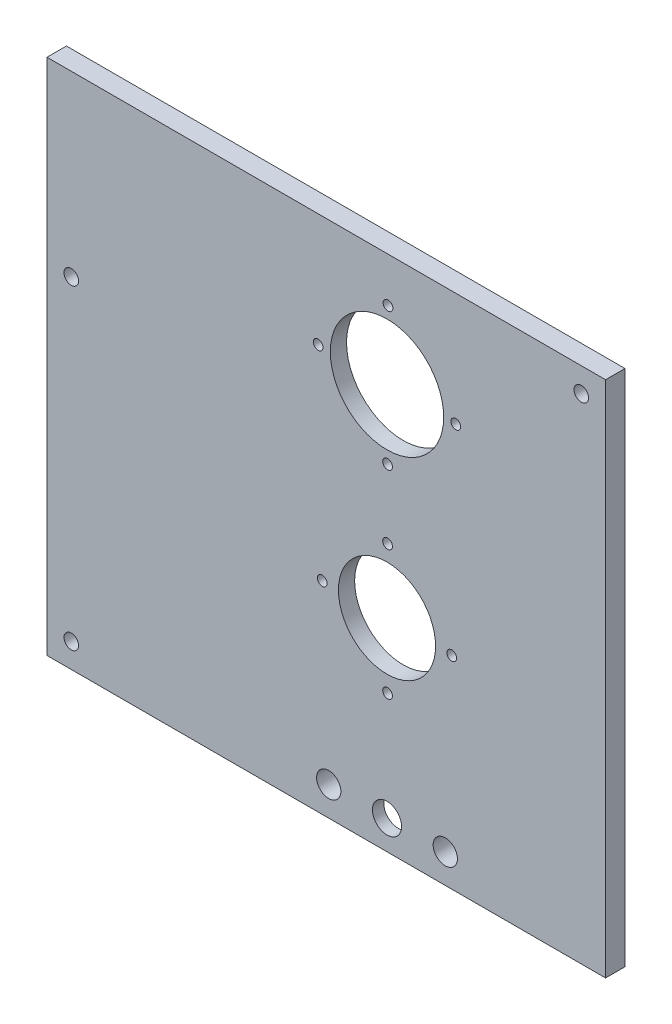
ISO-10303-21;
HEADER;
FILE_DESCRIPTION(('STEP AP214'),'2;1');
FILE_NAME('part.step','',(''),(''),'','','');
FILE_SCHEMA(('AUTOMOTIVE_DESIGN { 1 0 10303 214 1 1 1 1 }'));
ENDSEC;
DATA;
#1=APPLICATION_CONTEXT('core data for automotive mechanical design processes');
#2=APPLICATION_PROTOCOL_DEFINITION('international standard','automotive_design',2000,#1);
#3=PRODUCT_CONTEXT('',#1,'mechanical');
#4=PRODUCT('Part','Part','',(#3));
#5=PRODUCT_RELATED_PRODUCT_CATEGORY('part','',(#4));
#6=PRODUCT_DEFINITION_FORMATION('','',#4);
#7=PRODUCT_DEFINITION_CONTEXT('part definition',#1,'design');
#8=PRODUCT_DEFINITION('design','',#6,#7);
#9=PRODUCT_DEFINITION_SHAPE('','',#8);
#10=(LENGTH_UNIT() NAMED_UNIT(*) SI_UNIT(.MILLI.,.METRE.));
#11=(NAMED_UNIT(*) PLANE_ANGLE_UNIT() SI_UNIT($,.RADIAN.));
#12=(NAMED_UNIT(*) SI_UNIT($,.STERADIAN.) SOLID_ANGLE_UNIT());
#13=UNCERTAINTY_MEASURE_WITH_UNIT(LENGTH_MEASURE(1.E-05),#10,'distance_accuracy_value','');
#14=(GEOMETRIC_REPRESENTATION_CONTEXT(3) GLOBAL_UNCERTAINTY_ASSIGNED_CONTEXT((#13)) GLOBAL_UNIT_ASSIGNED_CONTEXT((#10,
#11,#12)) REPRESENTATION_CONTEXT('',''));
#15=CARTESIAN_POINT('',(0.,0.,0.));
#16=DIRECTION('',(0.,0.,1.));
#17=DIRECTION('',(1.,0.,0.));
#18=AXIS2_PLACEMENT_3D('',#15,#16,#17);
#19=CARTESIAN_POINT('',(70.,-262.,0.));
#20=DIRECTION('',(0.,0.,1.));
#21=DIRECTION('',(1.,0.,0.));
#22=AXIS2_PLACEMENT_3D('',#19,#20,#21);
#23=CYLINDRICAL_SURFACE('',#22,9.);
#24=CARTESIAN_POINT('',(70.,-262.,12.));
#25=DIRECTION('',(0.,0.,1.));
#26=DIRECTION('',(1.,0.,0.));
#27=AXIS2_PLACEMENT_3D('',#24,#25,#26);
#28=CIRCLE('',#27,9.);
#29=CARTESIAN_POINT('',(79.,-262.,12.));
#30=VERTEX_POINT('',#29);
#31=EDGE_CURVE('E196',#30,#30,#28,.T.);
#32=ORIENTED_EDGE('',*,*,#31,.T.);
#33=EDGE_LOOP('',(#32));
#34=FACE_BOUND('',#33,.T.);
#35=CARTESIAN_POINT('',(70.,-262.,5.));
#36=DIRECTION('',(0.,0.,-1.));
#37=DIRECTION('',(-1.,0.,0.));
#38=AXIS2_PLACEMENT_3D('',#35,#36,#37);
#39=CIRCLE('',#38,9.);
#40=CARTESIAN_POINT('',(61.,-262.,5.));
#41=VERTEX_POINT('',#40);
#42=EDGE_CURVE('E37',#41,#41,#39,.F.);
#43=ORIENTED_EDGE('',*,*,#42,.F.);
#44=EDGE_LOOP('',(#43));
#45=FACE_BOUND('',#44,.T.);
#46=ADVANCED_FACE('F33',(#34,#45),#23,.F.);
#47=CARTESIAN_POINT('',(70.,-155.,12.));
#48=DIRECTION('',(0.,0.,-1.));
#49=DIRECTION('',(-1.,0.,0.));
#50=AXIS2_PLACEMENT_3D('',#47,#48,#49);
#51=CYLINDRICAL_SURFACE('',#50,30.);
#52=CARTESIAN_POINT('',(70.,-155.,12.));
#53=DIRECTION('',(0.,0.,1.));
#54=DIRECTION('',(1.,0.,0.));
#55=AXIS2_PLACEMENT_3D('',#52,#53,#54);
#56=CIRCLE('',#55,30.);
#57=CARTESIAN_POINT('',(100.,-155.,12.));
#58=VERTEX_POINT('',#57);
#59=EDGE_CURVE('E233',#58,#58,#56,.T.);
#60=ORIENTED_EDGE('',*,*,#59,.T.);
#61=EDGE_LOOP('',(#60));
#62=FACE_BOUND('',#61,.T.);
#63=CARTESIAN_POINT('',(70.,-155.,2.));
#64=DIRECTION('',(0.,0.,-1.));
#65=DIRECTION('',(-1.,0.,0.));
#66=AXIS2_PLACEMENT_3D('',#63,#64,#65);
#67=CIRCLE('',#66,30.);
#68=CARTESIAN_POINT('',(40.,-155.,2.));
#69=VERTEX_POINT('',#68);
#70=EDGE_CURVE('E155',#69,#69,#67,.T.);
#71=ORIENTED_EDGE('',*,*,#70,.T.);
#72=EDGE_LOOP('',(#71));
#73=FACE_BOUND('',#72,.T.);
#74=ADVANCED_FACE('F348',(#62,#73),#51,.F.);
#75=CARTESIAN_POINT('',(70.,-30.,12.));
#76=DIRECTION('',(0.,0.,-1.));
#77=DIRECTION('',(-1.,0.,0.));
#78=AXIS2_PLACEMENT_3D('',#75,#76,#77);
#79=CYLINDRICAL_SURFACE('',#78,35.);
#80=CARTESIAN_POINT('',(70.,-30.,12.));
#81=DIRECTION('',(0.,0.,1.));
#82=DIRECTION('',(1.,0.,0.));
#83=AXIS2_PLACEMENT_3D('',#80,#81,#82);
#84=CIRCLE('',#83,35.);
#85=CARTESIAN_POINT('',(105.,-30.,12.));
#86=VERTEX_POINT('',#85);
#87=EDGE_CURVE('E230',#86,#86,#84,.T.);
#88=ORIENTED_EDGE('',*,*,#87,.T.);
#89=EDGE_LOOP('',(#88));
#90=FACE_BOUND('',#89,.T.);
#91=CARTESIAN_POINT('',(70.,-30.,2.));
#92=DIRECTION('',(0.,0.,-1.));
#93=DIRECTION('',(-1.,0.,0.));
#94=AXIS2_PLACEMENT_3D('',#91,#92,#93);
#95=CIRCLE('',#94,35.);
#96=CARTESIAN_POINT('',(35.,-30.,2.));
#97=VERTEX_POINT('',#96);
#98=EDGE_CURVE('E150',#97,#97,#95,.T.);
#99=ORIENTED_EDGE('',*,*,#98,.T.);
#100=EDGE_LOOP('',(#99));
#101=FACE_BOUND('',#100,.T.);
#102=ADVANCED_FACE('F297',(#90,#101),#79,.F.);
#103=CARTESIAN_POINT('',(-140.,40.,12.));
#104=DIRECTION('',(0.,0.,-1.));
#105=DIRECTION('',(-1.,0.,0.));
#106=AXIS2_PLACEMENT_3D('',#103,#104,#105);
#107=PLANE('',#106);
#108=CARTESIAN_POINT('',(106.,-262.,12.));
#109=DIRECTION('',(0.,0.,1.));
#110=DIRECTION('',(1.,0.,0.));
#111=AXIS2_PLACEMENT_3D('',#108,#109,#110);
#112=CIRCLE('',#111,7.50000000000001);
#113=CARTESIAN_POINT('',(113.5,-262.,12.));
#114=VERTEX_POINT('',#113);
#115=EDGE_CURVE('E269',#114,#114,#112,.T.);
#116=ORIENTED_EDGE('',*,*,#115,.F.);
#117=EDGE_LOOP('',(#116));
#118=FACE_BOUND('',#117,.T.);
#119=CARTESIAN_POINT('',(34.,-262.,12.));
#120=DIRECTION('',(0.,0.,1.));
#121=DIRECTION('',(1.,0.,0.));
#122=AXIS2_PLACEMENT_3D('',#119,#120,#121);
#123=CIRCLE('',#122,7.5);
#124=CARTESIAN_POINT('',(41.5,-262.,12.));
#125=VERTEX_POINT('',#124);
#126=EDGE_CURVE('E280',#125,#125,#123,.T.);
#127=ORIENTED_EDGE('',*,*,#126,.F.);
#128=EDGE_LOOP('',(#127));
#129=FACE_BOUND('',#128,.T.);
#130=ORIENTED_EDGE('',*,*,#31,.F.);
#131=EDGE_LOOP('',(#130));
#132=FACE_BOUND('',#131,.T.);
#133=CARTESIAN_POINT('',(70.6097344804411,12.5,12.));
#134=DIRECTION('',(0.,0.,1.));
#135=DIRECTION('',(1.,0.,0.));
#136=AXIS2_PLACEMENT_3D('',#133,#134,#135);
#137=CIRCLE('',#136,2.99999999999999);
#138=CARTESIAN_POINT('',(73.6097344804411,12.5,12.));
#139=VERTEX_POINT('',#138);
#140=EDGE_CURVE('E190',#139,#139,#137,.T.);
#141=ORIENTED_EDGE('',*,*,#140,.F.);
#142=EDGE_LOOP('',(#141));
#143=FACE_BOUND('',#142,.T.);
#144=CARTESIAN_POINT('',(70.358898569168,-72.5,12.));
#145=DIRECTION('',(0.,0.,1.));
#146=DIRECTION('',(1.,0.,0.));
#147=AXIS2_PLACEMENT_3D('',#144,#145,#146);
#148=CIRCLE('',#147,2.99999999999999);
#149=CARTESIAN_POINT('',(73.358898569168,-72.5,12.));
#150=VERTEX_POINT('',#149);
#151=EDGE_CURVE('E187',#150,#150,#148,.T.);
#152=ORIENTED_EDGE('',*,*,#151,.F.);
#153=EDGE_LOOP('',(#152));
#154=FACE_BOUND('',#153,.T.);
#155=CARTESIAN_POINT('',(112.5,-30.,12.));
#156=DIRECTION('',(0.,0.,1.));
#157=DIRECTION('',(1.,0.,0.));
#158=AXIS2_PLACEMENT_3D('',#155,#156,#157);
#159=CIRCLE('',#158,2.99999999999999);
#160=CARTESIAN_POINT('',(115.5,-30.,12.));
#161=VERTEX_POINT('',#160);
#162=EDGE_CURVE('E184',#161,#161,#159,.T.);
#163=ORIENTED_EDGE('',*,*,#162,.F.);
#164=EDGE_LOOP('',(#163));
#165=FACE_BOUND('',#164,.T.);
#166=CARTESIAN_POINT('',(27.5,-30.,12.));
#167=DIRECTION('',(0.,0.,1.));
#168=DIRECTION('',(1.,0.,0.));
#169=AXIS2_PLACEMENT_3D('',#166,#167,#168);
#170=CIRCLE('',#169,2.99999999999999);
#171=CARTESIAN_POINT('',(30.5,-30.,12.));
#172=VERTEX_POINT('',#171);
#173=EDGE_CURVE('E180',#172,#172,#170,.T.);
#174=ORIENTED_EDGE('',*,*,#173,.F.);
#175=EDGE_LOOP('',(#174));
#176=FACE_BOUND('',#175,.T.);
#177=CARTESIAN_POINT('',(110.,-155.,12.));
#178=DIRECTION('',(0.,0.,1.));
#179=DIRECTION('',(1.,0.,0.));
#180=AXIS2_PLACEMENT_3D('',#177,#178,#179);
#181=CIRCLE('',#180,2.99999999999999);
#182=CARTESIAN_POINT('',(113.,-155.,12.));
#183=VERTEX_POINT('',#182);
#184=EDGE_CURVE('E176',#183,#183,#181,.T.);
#185=ORIENTED_EDGE('',*,*,#184,.F.);
#186=EDGE_LOOP('',(#185));
#187=FACE_BOUND('',#186,.T.);
#188=CARTESIAN_POINT('',(70.358898569168,-195.,12.));
#189=DIRECTION('',(0.,0.,1.));
#190=DIRECTION('',(1.,0.,0.));
#191=AXIS2_PLACEMENT_3D('',#188,#189,#190);
#192=CIRCLE('',#191,2.99999999999999);
#193=CARTESIAN_POINT('',(73.358898569168,-195.,12.));
#194=VERTEX_POINT('',#193);
#195=EDGE_CURVE('E172',#194,#194,#192,.T.);
#196=ORIENTED_EDGE('',*,*,#195,.F.);
#197=EDGE_LOOP('',(#196));
#198=FACE_BOUND('',#197,.T.);
#199=CARTESIAN_POINT('',(30.,-155.,12.));
#200=DIRECTION('',(0.,0.,1.));
#201=DIRECTION('',(1.,0.,0.));
#202=AXIS2_PLACEMENT_3D('',#199,#200,#201);
#203=CIRCLE('',#202,2.99999999999999);
#204=CARTESIAN_POINT('',(33.,-155.,12.));
#205=VERTEX_POINT('',#204);
#206=EDGE_CURVE('E168',#205,#205,#203,.T.);
#207=ORIENTED_EDGE('',*,*,#206,.F.);
#208=EDGE_LOOP('',(#207));
#209=FACE_BOUND('',#208,.T.);
#210=CARTESIAN_POINT('',(70.358898569168,-115.,12.));
#211=DIRECTION('',(0.,0.,1.));
#212=DIRECTION('',(1.,0.,0.));
#213=AXIS2_PLACEMENT_3D('',#210,#211,#212);
#214=CIRCLE('',#213,2.99999999999999);
#215=CARTESIAN_POINT('',(73.358898569168,-115.,12.));
#216=VERTEX_POINT('',#215);
#217=EDGE_CURVE('E164',#216,#216,#214,.T.);
#218=ORIENTED_EDGE('',*,*,#217,.F.);
#219=EDGE_LOOP('',(#218));
#220=FACE_BOUND('',#219,.T.);
#221=ORIENTED_EDGE('',*,*,#87,.F.);
#222=EDGE_LOOP('',(#221));
#223=FACE_BOUND('',#222,.T.);
#224=CARTESIAN_POINT('',(-125.,-265.,12.));
#225=DIRECTION('',(0.,0.,1.));
#226=DIRECTION('',(1.,0.,0.));
#227=AXIS2_PLACEMENT_3D('',#224,#225,#226);
#228=CIRCLE('',#227,4.50000000000001);
#229=CARTESIAN_POINT('',(-120.5,-265.,12.));
#230=VERTEX_POINT('',#229);
#231=EDGE_CURVE('E239',#230,#230,#228,.T.);
#232=ORIENTED_EDGE('',*,*,#231,.F.);
#233=EDGE_LOOP('',(#232));
#234=FACE_BOUND('',#233,.T.);
#235=DIRECTION('',(-1.,0.,0.));
#236=VECTOR('',#235,1.);
#237=CARTESIAN_POINT('',(-140.,40.,12.));
#238=LINE('',#237,#236);
#239=CARTESIAN_POINT('',(205.,40.,12.));
#240=VERTEX_POINT('',#239);
#241=CARTESIAN_POINT('',(-140.,40.,12.));
#242=VERTEX_POINT('',#241);
#243=EDGE_CURVE('E131',#240,#242,#238,.T.);
#244=ORIENTED_EDGE('',*,*,#243,.T.);
#245=DIRECTION('',(0.,-1.,0.));
#246=VECTOR('',#245,1.);
#247=CARTESIAN_POINT('',(-140.,40.,12.));
#248=LINE('',#247,#246);
#249=CARTESIAN_POINT('',(-140.,-280.,12.));
#250=VERTEX_POINT('',#249);
#251=EDGE_CURVE('E138',#242,#250,#248,.T.);
#252=ORIENTED_EDGE('',*,*,#251,.T.);
#253=DIRECTION('',(1.,0.,0.));
#254=VECTOR('',#253,1.);
#255=CARTESIAN_POINT('',(-140.,-280.,12.));
#256=LINE('',#255,#254);
#257=CARTESIAN_POINT('',(205.,-280.,12.));
#258=VERTEX_POINT('',#257);
#259=EDGE_CURVE('E140',#250,#258,#256,.T.);
#260=ORIENTED_EDGE('',*,*,#259,.T.);
#261=DIRECTION('',(0.,1.,0.));
#262=VECTOR('',#261,1.);
#263=CARTESIAN_POINT('',(205.,40.,12.));
#264=LINE('',#263,#262);
#265=EDGE_CURVE('E58',#258,#240,#264,.T.);
#266=ORIENTED_EDGE('',*,*,#265,.T.);
#267=EDGE_LOOP('',(#244,#252,#260,#266));
#268=FACE_BOUND('',#267,.T.);
#269=CARTESIAN_POINT('',(190.,25.,12.));
#270=DIRECTION('',(0.,0.,1.));
#271=DIRECTION('',(1.,0.,0.));
#272=AXIS2_PLACEMENT_3D('',#269,#270,#271);
#273=CIRCLE('',#272,4.49999999999999);
#274=CARTESIAN_POINT('',(194.5,25.,12.));
#275=VERTEX_POINT('',#274);
#276=EDGE_CURVE('E245',#275,#275,#273,.T.);
#277=ORIENTED_EDGE('',*,*,#276,.F.);
#278=EDGE_LOOP('',(#277));
#279=FACE_BOUND('',#278,.T.);
#280=ORIENTED_EDGE('',*,*,#59,.F.);
#281=EDGE_LOOP('',(#280));
#282=FACE_BOUND('',#281,.T.);
#283=CARTESIAN_POINT('',(-125.,-70.,12.));
#284=DIRECTION('',(0.,0.,1.));
#285=DIRECTION('',(1.,0.,0.));
#286=AXIS2_PLACEMENT_3D('',#283,#284,#285);
#287=CIRCLE('',#286,4.50000000000001);
#288=CARTESIAN_POINT('',(-120.5,-70.,12.));
#289=VERTEX_POINT('',#288);
#290=EDGE_CURVE('E227',#289,#289,#287,.T.);
#291=ORIENTED_EDGE('',*,*,#290,.F.);
#292=EDGE_LOOP('',(#291));
#293=FACE_BOUND('',#292,.T.);
#294=ADVANCED_FACE('F260',(#118,#129,#132,#143,#154,#165,#176,#187,#198,#209,#220,#223,#234,
#268,#279,#282,#293),#107,.F.);
#295=CARTESIAN_POINT('',(-140.,40.,0.));
#296=DIRECTION('',(0.,0.,-1.));
#297=DIRECTION('',(-1.,0.,0.));
#298=AXIS2_PLACEMENT_3D('',#295,#296,#297);
#299=PLANE('',#298);
#300=DIRECTION('',(0.,-1.,0.));
#301=VECTOR('',#300,1.);
#302=CARTESIAN_POINT('',(88.,-262.,0.));
#303=LINE('',#302,#301);
#304=CARTESIAN_POINT('',(88.,-262.,0.));
#305=VERTEX_POINT('',#304);
#306=CARTESIAN_POINT('',(88.,-280.,0.));
#307=VERTEX_POINT('',#306);
#308=EDGE_CURVE('E618',#305,#307,#303,.T.);
#309=ORIENTED_EDGE('',*,*,#308,.F.);
#310=CARTESIAN_POINT('',(70.,-262.,0.));
#311=DIRECTION('',(0.,0.,-1.));
#312=DIRECTION('',(-1.,0.,0.));
#313=AXIS2_PLACEMENT_3D('',#310,#311,#312);
#314=CIRCLE('',#313,18.);
#315=CARTESIAN_POINT('',(52.,-262.,0.));
#316=VERTEX_POINT('',#315);
#317=EDGE_CURVE('E122',#316,#305,#314,.T.);
#318=ORIENTED_EDGE('',*,*,#317,.F.);
#319=DIRECTION('',(0.,1.,0.));
#320=VECTOR('',#319,1.);
#321=CARTESIAN_POINT('',(52.,-262.,0.));
#322=LINE('',#321,#320);
#323=CARTESIAN_POINT('',(52.,-280.,0.));
#324=VERTEX_POINT('',#323);
#325=EDGE_CURVE('E106',#324,#316,#322,.T.);
#326=ORIENTED_EDGE('',*,*,#325,.F.);
#327=DIRECTION('',(1.,0.,0.));
#328=VECTOR('',#327,1.);
#329=CARTESIAN_POINT('',(-140.,-280.,0.));
#330=LINE('',#329,#328);
#331=CARTESIAN_POINT('',(-140.,-280.,0.));
#332=VERTEX_POINT('',#331);
#333=EDGE_CURVE('E120',#332,#324,#330,.T.);
#334=ORIENTED_EDGE('',*,*,#333,.F.);
#335=DIRECTION('',(0.,-1.,0.));
#336=VECTOR('',#335,1.);
#337=CARTESIAN_POINT('',(-140.,40.,0.));
#338=LINE('',#337,#336);
#339=CARTESIAN_POINT('',(-140.,40.,0.));
#340=VERTEX_POINT('',#339);
#341=EDGE_CURVE('E133',#340,#332,#338,.T.);
#342=ORIENTED_EDGE('',*,*,#341,.F.);
#343=DIRECTION('',(-1.,0.,0.));
#344=VECTOR('',#343,1.);
#345=CARTESIAN_POINT('',(-140.,40.,0.));
#346=LINE('',#345,#344);
#347=CARTESIAN_POINT('',(205.,40.,0.));
#348=VERTEX_POINT('',#347);
#349=EDGE_CURVE('E247',#348,#340,#346,.T.);
#350=ORIENTED_EDGE('',*,*,#349,.F.);
#351=DIRECTION('',(0.,1.,0.));
#352=VECTOR('',#351,1.);
#353=CARTESIAN_POINT('',(205.,40.,0.));
#354=LINE('',#353,#352);
#355=CARTESIAN_POINT('',(205.,-280.,0.));
#356=VERTEX_POINT('',#355);
#357=EDGE_CURVE('E128',#356,#348,#354,.T.);
#358=ORIENTED_EDGE('',*,*,#357,.F.);
#359=EDGE_CURVE('E129',#307,#356,#330,.T.);
#360=ORIENTED_EDGE('',*,*,#359,.F.);
#361=EDGE_LOOP('',(#309,#318,#326,#334,#342,#350,#358,#360));
#362=FACE_BOUND('',#361,.T.);
#363=CARTESIAN_POINT('',(106.,-262.,0.));
#364=DIRECTION('',(0.,0.,1.));
#365=DIRECTION('',(1.,0.,0.));
#366=AXIS2_PLACEMENT_3D('',#363,#364,#365);
#367=CIRCLE('',#366,7.50000000000001);
#368=CARTESIAN_POINT('',(113.5,-262.,0.));
#369=VERTEX_POINT('',#368);
#370=EDGE_CURVE('E277',#369,#369,#367,.T.);
#371=ORIENTED_EDGE('',*,*,#370,.T.);
#372=EDGE_LOOP('',(#371));
#373=FACE_BOUND('',#372,.T.);
#374=CARTESIAN_POINT('',(34.,-262.,0.));
#375=DIRECTION('',(0.,0.,1.));
#376=DIRECTION('',(1.,0.,0.));
#377=AXIS2_PLACEMENT_3D('',#374,#375,#376);
#378=CIRCLE('',#377,7.5);
#379=CARTESIAN_POINT('',(41.5,-262.,0.));
#380=VERTEX_POINT('',#379);
#381=EDGE_CURVE('E201',#380,#380,#378,.T.);
#382=ORIENTED_EDGE('',*,*,#381,.T.);
#383=EDGE_LOOP('',(#382));
#384=FACE_BOUND('',#383,.T.);
#385=CARTESIAN_POINT('',(70.,-155.,0.));
#386=DIRECTION('',(0.,0.,-1.));
#387=DIRECTION('',(-1.,0.,0.));
#388=AXIS2_PLACEMENT_3D('',#385,#386,#387);
#389=CIRCLE('',#388,47.5);
#390=CARTESIAN_POINT('',(22.5,-155.,0.));
#391=VERTEX_POINT('',#390);
#392=EDGE_CURVE('E163',#391,#391,#389,.T.);
#393=ORIENTED_EDGE('',*,*,#392,.F.);
#394=EDGE_LOOP('',(#393));
#395=FACE_BOUND('',#394,.T.);
#396=CARTESIAN_POINT('',(70.,-30.,0.));
#397=DIRECTION('',(0.,0.,-1.));
#398=DIRECTION('',(-1.,0.,0.));
#399=AXIS2_PLACEMENT_3D('',#396,#397,#398);
#400=CIRCLE('',#399,55.);
#401=CARTESIAN_POINT('',(15.,-30.,0.));
#402=VERTEX_POINT('',#401);
#403=EDGE_CURVE('E158',#402,#402,#400,.T.);
#404=ORIENTED_EDGE('',*,*,#403,.F.);
#405=EDGE_LOOP('',(#404));
#406=FACE_BOUND('',#405,.T.);
#407=CARTESIAN_POINT('',(-125.,-265.,0.));
#408=DIRECTION('',(0.,0.,1.));
#409=DIRECTION('',(1.,0.,0.));
#410=AXIS2_PLACEMENT_3D('',#407,#408,#409);
#411=CIRCLE('',#410,4.50000000000001);
#412=CARTESIAN_POINT('',(-120.5,-265.,0.));
#413=VERTEX_POINT('',#412);
#414=EDGE_CURVE('E236',#413,#413,#411,.T.);
#415=ORIENTED_EDGE('',*,*,#414,.T.);
#416=EDGE_LOOP('',(#415));
#417=FACE_BOUND('',#416,.T.);
#418=CARTESIAN_POINT('',(190.,25.,0.));
#419=DIRECTION('',(0.,0.,1.));
#420=DIRECTION('',(1.,0.,0.));
#421=AXIS2_PLACEMENT_3D('',#418,#419,#420);
#422=CIRCLE('',#421,4.49999999999999);
#423=CARTESIAN_POINT('',(194.5,25.,0.));
#424=VERTEX_POINT('',#423);
#425=EDGE_CURVE('E242',#424,#424,#422,.T.);
#426=ORIENTED_EDGE('',*,*,#425,.T.);
#427=EDGE_LOOP('',(#426));
#428=FACE_BOUND('',#427,.T.);
#429=CARTESIAN_POINT('',(-125.,-70.,0.));
#430=DIRECTION('',(0.,0.,1.));
#431=DIRECTION('',(1.,0.,0.));
#432=AXIS2_PLACEMENT_3D('',#429,#430,#431);
#433=CIRCLE('',#432,4.50000000000001);
#434=CARTESIAN_POINT('',(-120.5,-70.,0.));
#435=VERTEX_POINT('',#434);
#436=EDGE_CURVE('E153',#435,#435,#433,.T.);
#437=ORIENTED_EDGE('',*,*,#436,.T.);
#438=EDGE_LOOP('',(#437));
#439=FACE_BOUND('',#438,.T.);
#440=ADVANCED_FACE('F118',(#362,#373,#384,#395,#406,#417,#428,#439),#299,.T.);
#441=CARTESIAN_POINT('',(-140.,40.,12.));
#442=DIRECTION('',(0.,-1.,0.));
#443=DIRECTION('',(0.,0.,-1.));
#444=AXIS2_PLACEMENT_3D('',#441,#442,#443);
#445=PLANE('',#444);
#446=ORIENTED_EDGE('',*,*,#349,.T.);
#447=DIRECTION('',(0.,0.,-1.));
#448=VECTOR('',#447,1.);
#449=CARTESIAN_POINT('',(-140.,40.,12.));
#450=LINE('',#449,#448);
#451=EDGE_CURVE('E11',#242,#340,#450,.T.);
#452=ORIENTED_EDGE('',*,*,#451,.F.);
#453=ORIENTED_EDGE('',*,*,#243,.F.);
#454=DIRECTION('',(0.,0.,-1.));
#455=VECTOR('',#454,1.);
#456=CARTESIAN_POINT('',(205.,40.,12.));
#457=LINE('',#456,#455);
#458=EDGE_CURVE('E143',#240,#348,#457,.T.);
#459=ORIENTED_EDGE('',*,*,#458,.T.);
#460=EDGE_LOOP('',(#446,#452,#453,#459));
#461=FACE_BOUND('',#460,.T.);
#462=ADVANCED_FACE('F35',(#461),#445,.F.);
#463=CARTESIAN_POINT('',(-140.,40.,12.));
#464=DIRECTION('',(1.,0.,0.));
#465=DIRECTION('',(0.,1.,0.));
#466=AXIS2_PLACEMENT_3D('',#463,#464,#465);
#467=PLANE('',#466);
#468=ORIENTED_EDGE('',*,*,#341,.T.);
#469=DIRECTION('',(0.,0.,-1.));
#470=VECTOR('',#469,1.);
#471=CARTESIAN_POINT('',(-140.,-280.,12.));
#472=LINE('',#471,#470);
#473=EDGE_CURVE('E42',#250,#332,#472,.T.);
#474=ORIENTED_EDGE('',*,*,#473,.F.);
#475=ORIENTED_EDGE('',*,*,#251,.F.);
#476=ORIENTED_EDGE('',*,*,#451,.T.);
#477=EDGE_LOOP('',(#468,#474,#475,#476));
#478=FACE_BOUND('',#477,.T.);
#479=ADVANCED_FACE('F253',(#478),#467,.F.);
#480=CARTESIAN_POINT('',(-140.,-280.,12.));
#481=DIRECTION('',(0.,1.,0.));
#482=DIRECTION('',(0.,0.,1.));
#483=AXIS2_PLACEMENT_3D('',#480,#481,#482);
#484=PLANE('',#483);
#485=DIRECTION('',(-1.,0.,0.));
#486=VECTOR('',#485,1.);
#487=CARTESIAN_POINT('',(88.,-280.,5.));
#488=LINE('',#487,#486);
#489=CARTESIAN_POINT('',(88.,-280.,5.));
#490=VERTEX_POINT('',#489);
#491=CARTESIAN_POINT('',(52.,-280.,5.));
#492=VERTEX_POINT('',#491);
#493=EDGE_CURVE('E264',#490,#492,#488,.T.);
#494=ORIENTED_EDGE('',*,*,#493,.F.);
#495=DIRECTION('',(0.,0.,-1.));
#496=VECTOR('',#495,1.);
#497=CARTESIAN_POINT('',(88.,-280.,5.));
#498=LINE('',#497,#496);
#499=EDGE_CURVE('E263',#490,#307,#498,.T.);
#500=ORIENTED_EDGE('',*,*,#499,.T.);
#501=ORIENTED_EDGE('',*,*,#359,.T.);
#502=DIRECTION('',(0.,0.,-1.));
#503=VECTOR('',#502,1.);
#504=CARTESIAN_POINT('',(205.,-280.,12.));
#505=LINE('',#504,#503);
#506=EDGE_CURVE('E146',#258,#356,#505,.T.);
#507=ORIENTED_EDGE('',*,*,#506,.F.);
#508=ORIENTED_EDGE('',*,*,#259,.F.);
#509=ORIENTED_EDGE('',*,*,#473,.T.);
#510=ORIENTED_EDGE('',*,*,#333,.T.);
#511=DIRECTION('',(0.,0.,-1.));
#512=VECTOR('',#511,1.);
#513=CARTESIAN_POINT('',(52.,-280.,5.));
#514=LINE('',#513,#512);
#515=EDGE_CURVE('E103',#492,#324,#514,.T.);
#516=ORIENTED_EDGE('',*,*,#515,.F.);
#517=EDGE_LOOP('',(#494,#500,#501,#507,#508,#509,#510,#516));
#518=FACE_BOUND('',#517,.T.);
#519=ADVANCED_FACE('F125',(#518),#484,.F.);
#520=CARTESIAN_POINT('',(205.,40.,12.));
#521=DIRECTION('',(-1.,0.,0.));
#522=DIRECTION('',(0.,-1.,0.));
#523=AXIS2_PLACEMENT_3D('',#520,#521,#522);
#524=PLANE('',#523);
#525=ORIENTED_EDGE('',*,*,#357,.T.);
#526=ORIENTED_EDGE('',*,*,#458,.F.);
#527=ORIENTED_EDGE('',*,*,#265,.F.);
#528=ORIENTED_EDGE('',*,*,#506,.T.);
#529=EDGE_LOOP('',(#525,#526,#527,#528));
#530=FACE_BOUND('',#529,.T.);
#531=ADVANCED_FACE('F257',(#530),#524,.F.);
#532=CARTESIAN_POINT('',(190.,25.,12.));
#533=DIRECTION('',(0.,0.,-1.));
#534=DIRECTION('',(-1.,0.,0.));
#535=AXIS2_PLACEMENT_3D('',#532,#533,#534);
#536=CYLINDRICAL_SURFACE('',#535,4.49999999999999);
#537=ORIENTED_EDGE('',*,*,#276,.T.);
#538=EDGE_LOOP('',(#537));
#539=FACE_BOUND('',#538,.T.);
#540=ORIENTED_EDGE('',*,*,#425,.F.);
#541=EDGE_LOOP('',(#540));
#542=FACE_BOUND('',#541,.T.);
#543=ADVANCED_FACE('F325',(#539,#542),#536,.F.);
#544=CARTESIAN_POINT('',(-125.,-265.,12.));
#545=DIRECTION('',(0.,0.,-1.));
#546=DIRECTION('',(-1.,0.,0.));
#547=AXIS2_PLACEMENT_3D('',#544,#545,#546);
#548=CYLINDRICAL_SURFACE('',#547,4.50000000000001);
#549=ORIENTED_EDGE('',*,*,#231,.T.);
#550=EDGE_LOOP('',(#549));
#551=FACE_BOUND('',#550,.T.);
#552=ORIENTED_EDGE('',*,*,#414,.F.);
#553=EDGE_LOOP('',(#552));
#554=FACE_BOUND('',#553,.T.);
#555=ADVANCED_FACE('F321',(#551,#554),#548,.F.);
#556=CARTESIAN_POINT('',(-125.,-70.,12.));
#557=DIRECTION('',(0.,0.,-1.));
#558=DIRECTION('',(-1.,0.,0.));
#559=AXIS2_PLACEMENT_3D('',#556,#557,#558);
#560=CYLINDRICAL_SURFACE('',#559,4.50000000000001);
#561=ORIENTED_EDGE('',*,*,#290,.T.);
#562=EDGE_LOOP('',(#561));
#563=FACE_BOUND('',#562,.T.);
#564=ORIENTED_EDGE('',*,*,#436,.F.);
#565=EDGE_LOOP('',(#564));
#566=FACE_BOUND('',#565,.T.);
#567=ADVANCED_FACE('F324',(#563,#566),#560,.F.);
#568=CARTESIAN_POINT('',(70.,-30.,2.));
#569=DIRECTION('',(0.,0.,-1.));
#570=DIRECTION('',(-1.,0.,0.));
#571=AXIS2_PLACEMENT_3D('',#568,#569,#570);
#572=CYLINDRICAL_SURFACE('',#571,55.);
#573=CARTESIAN_POINT('',(70.,-30.,2.));
#574=DIRECTION('',(0.,0.,-1.));
#575=DIRECTION('',(-1.,0.,0.));
#576=AXIS2_PLACEMENT_3D('',#573,#574,#575);
#577=CIRCLE('',#576,55.);
#578=CARTESIAN_POINT('',(15.,-30.,2.));
#579=VERTEX_POINT('',#578);
#580=EDGE_CURVE('E154',#579,#579,#577,.T.);
#581=ORIENTED_EDGE('',*,*,#580,.F.);
#582=EDGE_LOOP('',(#581));
#583=FACE_BOUND('',#582,.T.);
#584=ORIENTED_EDGE('',*,*,#403,.T.);
#585=EDGE_LOOP('',(#584));
#586=FACE_BOUND('',#585,.T.);
#587=ADVANCED_FACE('F337',(#583,#586),#572,.F.);
#588=CARTESIAN_POINT('',(70.,-30.,2.));
#589=DIRECTION('',(0.,0.,-1.));
#590=DIRECTION('',(-1.,0.,0.));
#591=AXIS2_PLACEMENT_3D('',#588,#589,#590);
#592=PLANE('',#591);
#593=CARTESIAN_POINT('',(70.6097344804411,12.5,2.));
#594=DIRECTION('',(0.,0.,-1.));
#595=DIRECTION('',(-1.,0.,0.));
#596=AXIS2_PLACEMENT_3D('',#593,#594,#595);
#597=CIRCLE('',#596,3.);
#598=CARTESIAN_POINT('',(67.6097344804411,12.5,2.));
#599=VERTEX_POINT('',#598);
#600=EDGE_CURVE('E188',#599,#599,#597,.T.);
#601=ORIENTED_EDGE('',*,*,#600,.F.);
#602=EDGE_LOOP('',(#601));
#603=FACE_BOUND('',#602,.T.);
#604=CARTESIAN_POINT('',(70.358898569168,-72.5,2.));
#605=DIRECTION('',(0.,0.,-1.));
#606=DIRECTION('',(-1.,0.,0.));
#607=AXIS2_PLACEMENT_3D('',#604,#605,#606);
#608=CIRCLE('',#607,3.);
#609=CARTESIAN_POINT('',(67.358898569168,-72.5,2.));
#610=VERTEX_POINT('',#609);
#611=EDGE_CURVE('E185',#610,#610,#608,.T.);
#612=ORIENTED_EDGE('',*,*,#611,.F.);
#613=EDGE_LOOP('',(#612));
#614=FACE_BOUND('',#613,.T.);
#615=CARTESIAN_POINT('',(112.5,-30.,2.));
#616=DIRECTION('',(0.,0.,-1.));
#617=DIRECTION('',(-1.,0.,0.));
#618=AXIS2_PLACEMENT_3D('',#615,#616,#617);
#619=CIRCLE('',#618,3.);
#620=CARTESIAN_POINT('',(109.5,-30.,2.));
#621=VERTEX_POINT('',#620);
#622=EDGE_CURVE('E181',#621,#621,#619,.T.);
#623=ORIENTED_EDGE('',*,*,#622,.F.);
#624=EDGE_LOOP('',(#623));
#625=FACE_BOUND('',#624,.T.);
#626=CARTESIAN_POINT('',(27.5,-30.,2.));
#627=DIRECTION('',(0.,0.,-1.));
#628=DIRECTION('',(-1.,0.,0.));
#629=AXIS2_PLACEMENT_3D('',#626,#627,#628);
#630=CIRCLE('',#629,2.99999999999999);
#631=CARTESIAN_POINT('',(24.5,-30.,2.));
#632=VERTEX_POINT('',#631);
#633=EDGE_CURVE('E177',#632,#632,#630,.T.);
#634=ORIENTED_EDGE('',*,*,#633,.F.);
#635=EDGE_LOOP('',(#634));
#636=FACE_BOUND('',#635,.T.);
#637=ORIENTED_EDGE('',*,*,#98,.F.);
#638=EDGE_LOOP('',(#637));
#639=FACE_BOUND('',#638,.T.);
#640=ORIENTED_EDGE('',*,*,#580,.T.);
#641=EDGE_LOOP('',(#640));
#642=FACE_BOUND('',#641,.T.);
#643=ADVANCED_FACE('F343',(#603,#614,#625,#636,#639,#642),#592,.T.);
#644=CARTESIAN_POINT('',(70.,-155.,2.));
#645=DIRECTION('',(0.,0.,-1.));
#646=DIRECTION('',(-1.,0.,0.));
#647=AXIS2_PLACEMENT_3D('',#644,#645,#646);
#648=CYLINDRICAL_SURFACE('',#647,47.5);
#649=CARTESIAN_POINT('',(70.,-155.,2.));
#650=DIRECTION('',(0.,0.,-1.));
#651=DIRECTION('',(-1.,0.,0.));
#652=AXIS2_PLACEMENT_3D('',#649,#650,#651);
#653=CIRCLE('',#652,47.5);
#654=CARTESIAN_POINT('',(22.5,-155.,2.));
#655=VERTEX_POINT('',#654);
#656=EDGE_CURVE('E159',#655,#655,#653,.T.);
#657=ORIENTED_EDGE('',*,*,#656,.F.);
#658=EDGE_LOOP('',(#657));
#659=FACE_BOUND('',#658,.T.);
#660=ORIENTED_EDGE('',*,*,#392,.T.);
#661=EDGE_LOOP('',(#660));
#662=FACE_BOUND('',#661,.T.);
#663=ADVANCED_FACE('F392',(#659,#662),#648,.F.);
#664=CARTESIAN_POINT('',(70.,-155.,2.));
#665=DIRECTION('',(0.,0.,-1.));
#666=DIRECTION('',(-1.,0.,0.));
#667=AXIS2_PLACEMENT_3D('',#664,#665,#666);
#668=PLANE('',#667);
#669=CARTESIAN_POINT('',(110.,-155.,2.));
#670=DIRECTION('',(0.,0.,-1.));
#671=DIRECTION('',(-1.,0.,0.));
#672=AXIS2_PLACEMENT_3D('',#669,#670,#671);
#673=CIRCLE('',#672,3.);
#674=CARTESIAN_POINT('',(107.,-155.,2.));
#675=VERTEX_POINT('',#674);
#676=EDGE_CURVE('E173',#675,#675,#673,.T.);
#677=ORIENTED_EDGE('',*,*,#676,.F.);
#678=EDGE_LOOP('',(#677));
#679=FACE_BOUND('',#678,.T.);
#680=CARTESIAN_POINT('',(70.358898569168,-195.,2.));
#681=DIRECTION('',(0.,0.,-1.));
#682=DIRECTION('',(-1.,0.,0.));
#683=AXIS2_PLACEMENT_3D('',#680,#681,#682);
#684=CIRCLE('',#683,3.);
#685=CARTESIAN_POINT('',(67.358898569168,-195.,2.));
#686=VERTEX_POINT('',#685);
#687=EDGE_CURVE('E169',#686,#686,#684,.T.);
#688=ORIENTED_EDGE('',*,*,#687,.F.);
#689=EDGE_LOOP('',(#688));
#690=FACE_BOUND('',#689,.T.);
#691=CARTESIAN_POINT('',(30.,-155.,2.));
#692=DIRECTION('',(0.,0.,-1.));
#693=DIRECTION('',(-1.,0.,0.));
#694=AXIS2_PLACEMENT_3D('',#691,#692,#693);
#695=CIRCLE('',#694,2.99999999999999);
#696=CARTESIAN_POINT('',(27.,-155.,2.));
#697=VERTEX_POINT('',#696);
#698=EDGE_CURVE('E165',#697,#697,#695,.T.);
#699=ORIENTED_EDGE('',*,*,#698,.F.);
#700=EDGE_LOOP('',(#699));
#701=FACE_BOUND('',#700,.T.);
#702=CARTESIAN_POINT('',(70.358898569168,-115.,2.));
#703=DIRECTION('',(0.,0.,-1.));
#704=DIRECTION('',(-1.,0.,0.));
#705=AXIS2_PLACEMENT_3D('',#702,#703,#704);
#706=CIRCLE('',#705,3.);
#707=CARTESIAN_POINT('',(67.358898569168,-115.,2.));
#708=VERTEX_POINT('',#707);
#709=EDGE_CURVE('E160',#708,#708,#706,.T.);
#710=ORIENTED_EDGE('',*,*,#709,.F.);
#711=EDGE_LOOP('',(#710));
#712=FACE_BOUND('',#711,.T.);
#713=ORIENTED_EDGE('',*,*,#70,.F.);
#714=EDGE_LOOP('',(#713));
#715=FACE_BOUND('',#714,.T.);
#716=ORIENTED_EDGE('',*,*,#656,.T.);
#717=EDGE_LOOP('',(#716));
#718=FACE_BOUND('',#717,.T.);
#719=ADVANCED_FACE('F388',(#679,#690,#701,#712,#715,#718),#668,.T.);
#720=CARTESIAN_POINT('',(70.358898569168,-115.,12.));
#721=DIRECTION('',(0.,0.,1.));
#722=DIRECTION('',(1.,0.,0.));
#723=AXIS2_PLACEMENT_3D('',#720,#721,#722);
#724=CYLINDRICAL_SURFACE('',#723,3.);
#725=ORIENTED_EDGE('',*,*,#709,.T.);
#726=EDGE_LOOP('',(#725));
#727=FACE_BOUND('',#726,.T.);
#728=ORIENTED_EDGE('',*,*,#217,.T.);
#729=EDGE_LOOP('',(#728));
#730=FACE_BOUND('',#729,.T.);
#731=ADVANCED_FACE('F384',(#727,#730),#724,.F.);
#732=CARTESIAN_POINT('',(30.,-155.,12.));
#733=DIRECTION('',(0.,0.,1.));
#734=DIRECTION('',(1.,0.,0.));
#735=AXIS2_PLACEMENT_3D('',#732,#733,#734);
#736=CYLINDRICAL_SURFACE('',#735,2.99999999999999);
#737=ORIENTED_EDGE('',*,*,#698,.T.);
#738=EDGE_LOOP('',(#737));
#739=FACE_BOUND('',#738,.T.);
#740=ORIENTED_EDGE('',*,*,#206,.T.);
#741=EDGE_LOOP('',(#740));
#742=FACE_BOUND('',#741,.T.);
#743=ADVANCED_FACE('F380',(#739,#742),#736,.F.);
#744=CARTESIAN_POINT('',(70.358898569168,-195.,12.));
#745=DIRECTION('',(0.,0.,1.));
#746=DIRECTION('',(1.,0.,0.));
#747=AXIS2_PLACEMENT_3D('',#744,#745,#746);
#748=CYLINDRICAL_SURFACE('',#747,3.);
#749=ORIENTED_EDGE('',*,*,#687,.T.);
#750=EDGE_LOOP('',(#749));
#751=FACE_BOUND('',#750,.T.);
#752=ORIENTED_EDGE('',*,*,#195,.T.);
#753=EDGE_LOOP('',(#752));
#754=FACE_BOUND('',#753,.T.);
#755=ADVANCED_FACE('F376',(#751,#754),#748,.F.);
#756=CARTESIAN_POINT('',(110.,-155.,12.));
#757=DIRECTION('',(0.,0.,1.));
#758=DIRECTION('',(1.,0.,0.));
#759=AXIS2_PLACEMENT_3D('',#756,#757,#758);
#760=CYLINDRICAL_SURFACE('',#759,3.);
#761=ORIENTED_EDGE('',*,*,#676,.T.);
#762=EDGE_LOOP('',(#761));
#763=FACE_BOUND('',#762,.T.);
#764=ORIENTED_EDGE('',*,*,#184,.T.);
#765=EDGE_LOOP('',(#764));
#766=FACE_BOUND('',#765,.T.);
#767=ADVANCED_FACE('F372',(#763,#766),#760,.F.);
#768=CARTESIAN_POINT('',(27.5,-30.,12.));
#769=DIRECTION('',(0.,0.,1.));
#770=DIRECTION('',(1.,0.,0.));
#771=AXIS2_PLACEMENT_3D('',#768,#769,#770);
#772=CYLINDRICAL_SURFACE('',#771,2.99999999999999);
#773=ORIENTED_EDGE('',*,*,#633,.T.);
#774=EDGE_LOOP('',(#773));
#775=FACE_BOUND('',#774,.T.);
#776=ORIENTED_EDGE('',*,*,#173,.T.);
#777=EDGE_LOOP('',(#776));
#778=FACE_BOUND('',#777,.T.);
#779=ADVANCED_FACE('F368',(#775,#778),#772,.F.);
#780=CARTESIAN_POINT('',(112.5,-30.,12.));
#781=DIRECTION('',(0.,0.,1.));
#782=DIRECTION('',(1.,0.,0.));
#783=AXIS2_PLACEMENT_3D('',#780,#781,#782);
#784=CYLINDRICAL_SURFACE('',#783,3.);
#785=ORIENTED_EDGE('',*,*,#622,.T.);
#786=EDGE_LOOP('',(#785));
#787=FACE_BOUND('',#786,.T.);
#788=ORIENTED_EDGE('',*,*,#162,.T.);
#789=EDGE_LOOP('',(#788));
#790=FACE_BOUND('',#789,.T.);
#791=ADVANCED_FACE('F364',(#787,#790),#784,.F.);
#792=CARTESIAN_POINT('',(70.358898569168,-72.5,12.));
#793=DIRECTION('',(0.,0.,1.));
#794=DIRECTION('',(1.,0.,0.));
#795=AXIS2_PLACEMENT_3D('',#792,#793,#794);
#796=CYLINDRICAL_SURFACE('',#795,3.);
#797=ORIENTED_EDGE('',*,*,#611,.T.);
#798=EDGE_LOOP('',(#797));
#799=FACE_BOUND('',#798,.T.);
#800=ORIENTED_EDGE('',*,*,#151,.T.);
#801=EDGE_LOOP('',(#800));
#802=FACE_BOUND('',#801,.T.);
#803=ADVANCED_FACE('F361',(#799,#802),#796,.F.);
#804=CARTESIAN_POINT('',(70.6097344804411,12.5,12.));
#805=DIRECTION('',(0.,0.,1.));
#806=DIRECTION('',(1.,0.,0.));
#807=AXIS2_PLACEMENT_3D('',#804,#805,#806);
#808=CYLINDRICAL_SURFACE('',#807,3.);
#809=ORIENTED_EDGE('',*,*,#600,.T.);
#810=EDGE_LOOP('',(#809));
#811=FACE_BOUND('',#810,.T.);
#812=ORIENTED_EDGE('',*,*,#140,.T.);
#813=EDGE_LOOP('',(#812));
#814=FACE_BOUND('',#813,.T.);
#815=ADVANCED_FACE('F291',(#811,#814),#808,.F.);
#816=CARTESIAN_POINT('',(34.,-262.,0.));
#817=DIRECTION('',(0.,0.,1.));
#818=DIRECTION('',(1.,0.,0.));
#819=AXIS2_PLACEMENT_3D('',#816,#817,#818);
#820=CYLINDRICAL_SURFACE('',#819,7.5);
#821=ORIENTED_EDGE('',*,*,#381,.F.);
#822=EDGE_LOOP('',(#821));
#823=FACE_BOUND('',#822,.T.);
#824=ORIENTED_EDGE('',*,*,#126,.T.);
#825=EDGE_LOOP('',(#824));
#826=FACE_BOUND('',#825,.T.);
#827=ADVANCED_FACE('F287',(#823,#826),#820,.F.);
#828=CARTESIAN_POINT('',(106.,-262.,0.));
#829=DIRECTION('',(0.,0.,1.));
#830=DIRECTION('',(1.,0.,0.));
#831=AXIS2_PLACEMENT_3D('',#828,#829,#830);
#832=CYLINDRICAL_SURFACE('',#831,7.50000000000001);
#833=ORIENTED_EDGE('',*,*,#370,.F.);
#834=EDGE_LOOP('',(#833));
#835=FACE_BOUND('',#834,.T.);
#836=ORIENTED_EDGE('',*,*,#115,.T.);
#837=EDGE_LOOP('',(#836));
#838=FACE_BOUND('',#837,.T.);
#839=ADVANCED_FACE('F290',(#835,#838),#832,.F.);
#840=CARTESIAN_POINT('',(70.,-262.,5.));
#841=DIRECTION('',(0.,0.,-1.));
#842=DIRECTION('',(-1.,0.,0.));
#843=AXIS2_PLACEMENT_3D('',#840,#841,#842);
#844=PLANE('',#843);
#845=ORIENTED_EDGE('',*,*,#493,.T.);
#846=DIRECTION('',(0.,1.,0.));
#847=VECTOR('',#846,1.);
#848=CARTESIAN_POINT('',(52.,-262.,5.));
#849=LINE('',#848,#847);
#850=CARTESIAN_POINT('',(52.,-262.,5.));
#851=VERTEX_POINT('',#850);
#852=EDGE_CURVE('E109',#492,#851,#849,.T.);
#853=ORIENTED_EDGE('',*,*,#852,.T.);
#854=CARTESIAN_POINT('',(70.,-262.,5.));
#855=DIRECTION('',(0.,0.,-1.));
#856=DIRECTION('',(-1.,0.,0.));
#857=AXIS2_PLACEMENT_3D('',#854,#855,#856);
#858=CIRCLE('',#857,18.);
#859=CARTESIAN_POINT('',(88.,-262.,5.));
#860=VERTEX_POINT('',#859);
#861=EDGE_CURVE('E623',#851,#860,#858,.T.);
#862=ORIENTED_EDGE('',*,*,#861,.T.);
#863=DIRECTION('',(0.,-1.,0.));
#864=VECTOR('',#863,1.);
#865=CARTESIAN_POINT('',(88.,-262.,5.));
#866=LINE('',#865,#864);
#867=EDGE_CURVE('E50',#860,#490,#866,.T.);
#868=ORIENTED_EDGE('',*,*,#867,.T.);
#869=EDGE_LOOP('',(#845,#853,#862,#868));
#870=FACE_BOUND('',#869,.T.);
#871=ORIENTED_EDGE('',*,*,#42,.T.);
#872=EDGE_LOOP('',(#871));
#873=FACE_BOUND('',#872,.T.);
#874=ADVANCED_FACE('F466',(#870,#873),#844,.T.);
#875=CARTESIAN_POINT('',(88.,-262.,5.));
#876=DIRECTION('',(1.,0.,0.));
#877=DIRECTION('',(0.,0.,-1.));
#878=AXIS2_PLACEMENT_3D('',#875,#876,#877);
#879=PLANE('',#878);
#880=ORIENTED_EDGE('',*,*,#308,.T.);
#881=ORIENTED_EDGE('',*,*,#499,.F.);
#882=ORIENTED_EDGE('',*,*,#867,.F.);
#883=DIRECTION('',(0.,0.,-1.));
#884=VECTOR('',#883,1.);
#885=CARTESIAN_POINT('',(88.,-262.,5.));
#886=LINE('',#885,#884);
#887=EDGE_CURVE('E266',#860,#305,#886,.T.);
#888=ORIENTED_EDGE('',*,*,#887,.T.);
#889=EDGE_LOOP('',(#880,#881,#882,#888));
#890=FACE_BOUND('',#889,.T.);
#891=ADVANCED_FACE('F472',(#890),#879,.F.);
#892=CARTESIAN_POINT('',(70.,-262.,5.));
#893=DIRECTION('',(0.,0.,-1.));
#894=DIRECTION('',(-1.,0.,0.));
#895=AXIS2_PLACEMENT_3D('',#892,#893,#894);
#896=CYLINDRICAL_SURFACE('',#895,18.);
#897=ORIENTED_EDGE('',*,*,#317,.T.);
#898=ORIENTED_EDGE('',*,*,#887,.F.);
#899=ORIENTED_EDGE('',*,*,#861,.F.);
#900=DIRECTION('',(0.,0.,-1.));
#901=VECTOR('',#900,1.);
#902=CARTESIAN_POINT('',(52.,-262.,5.));
#903=LINE('',#902,#901);
#904=EDGE_CURVE('E113',#851,#316,#903,.T.);
#905=ORIENTED_EDGE('',*,*,#904,.T.);
#906=EDGE_LOOP('',(#897,#898,#899,#905));
#907=FACE_BOUND('',#906,.T.);
#908=ADVANCED_FACE('F480',(#907),#896,.F.);
#909=CARTESIAN_POINT('',(52.,-262.,5.));
#910=DIRECTION('',(-1.,0.,0.));
#911=DIRECTION('',(0.,0.,1.));
#912=AXIS2_PLACEMENT_3D('',#909,#910,#911);
#913=PLANE('',#912);
#914=ORIENTED_EDGE('',*,*,#325,.T.);
#915=ORIENTED_EDGE('',*,*,#904,.F.);
#916=ORIENTED_EDGE('',*,*,#852,.F.);
#917=ORIENTED_EDGE('',*,*,#515,.T.);
#918=EDGE_LOOP('',(#914,#915,#916,#917));
#919=FACE_BOUND('',#918,.T.);
#920=ADVANCED_FACE('F105',(#919),#913,.F.);
#921=CLOSED_SHELL('',(#46,#74,#102,#294,#440,#462,#479,#519,#531,#543,#555,#567,#587,#643,#663,
#719,#731,#743,#755,#767,#779,#791,#803,#815,#827,#839,#874,#891,#908,#920));
#922=MANIFOLD_SOLID_BREP('B2',#921);
#923=ADVANCED_BREP_SHAPE_REPRESENTATION('',(#18,#922),#14);
#924=SHAPE_DEFINITION_REPRESENTATION(#9,#923);
ENDSEC;
END-ISO-10303-21;
